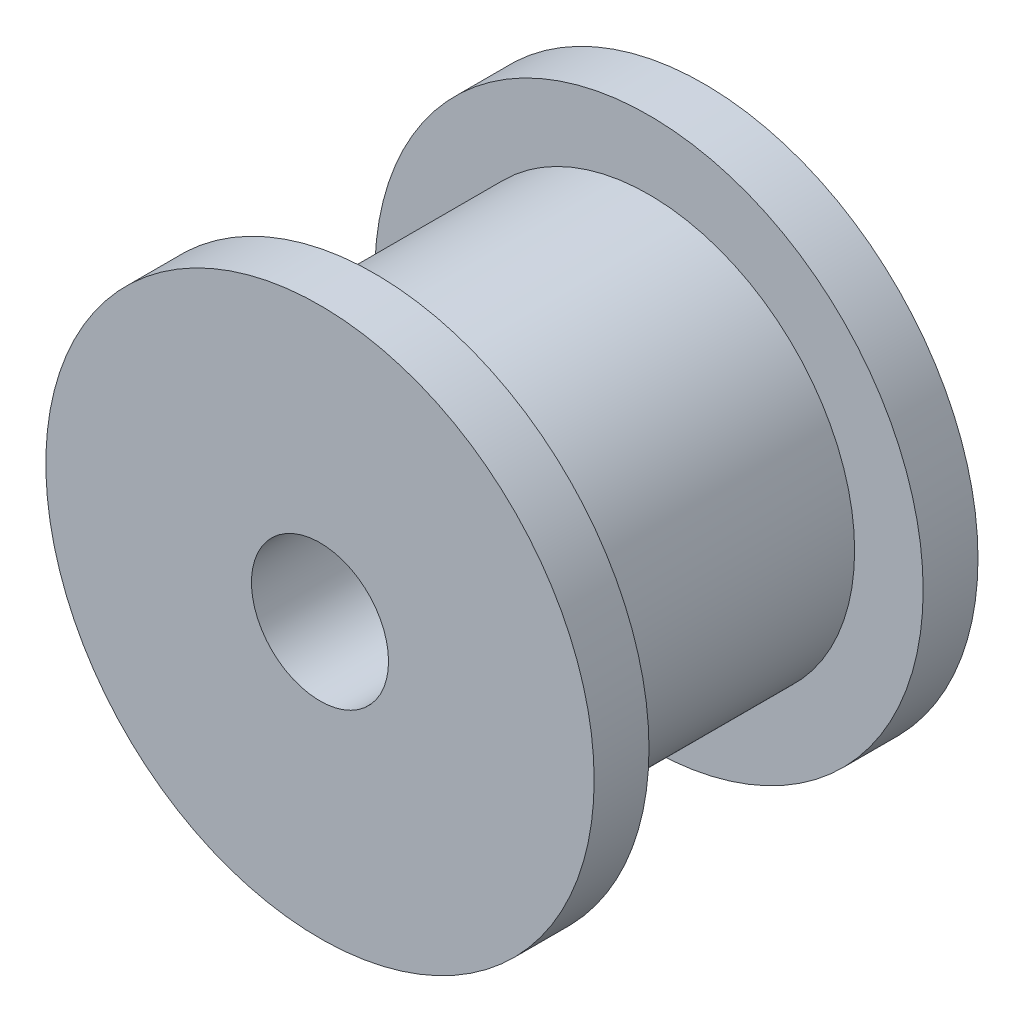
ISO-10303-21;
HEADER;
FILE_DESCRIPTION(('STEP AP214'),'2;1');
FILE_NAME('part.step','',(''),(''),'','','');
FILE_SCHEMA(('AUTOMOTIVE_DESIGN { 1 0 10303 214 1 1 1 1 }'));
ENDSEC;
DATA;
#1=APPLICATION_CONTEXT('core data for automotive mechanical design processes');
#2=APPLICATION_PROTOCOL_DEFINITION('international standard','automotive_design',2000,#1);
#3=PRODUCT_CONTEXT('',#1,'mechanical');
#4=PRODUCT('Part','Part','',(#3));
#5=PRODUCT_RELATED_PRODUCT_CATEGORY('part','',(#4));
#6=PRODUCT_DEFINITION_FORMATION('','',#4);
#7=PRODUCT_DEFINITION_CONTEXT('part definition',#1,'design');
#8=PRODUCT_DEFINITION('design','',#6,#7);
#9=PRODUCT_DEFINITION_SHAPE('','',#8);
#10=(LENGTH_UNIT() NAMED_UNIT(*) SI_UNIT(.MILLI.,.METRE.));
#11=(NAMED_UNIT(*) PLANE_ANGLE_UNIT() SI_UNIT($,.RADIAN.));
#12=(NAMED_UNIT(*) SI_UNIT($,.STERADIAN.) SOLID_ANGLE_UNIT());
#13=UNCERTAINTY_MEASURE_WITH_UNIT(LENGTH_MEASURE(1.E-05),#10,'distance_accuracy_value','');
#14=(GEOMETRIC_REPRESENTATION_CONTEXT(3) GLOBAL_UNCERTAINTY_ASSIGNED_CONTEXT((#13)) GLOBAL_UNIT_ASSIGNED_CONTEXT((#10,
#11,#12)) REPRESENTATION_CONTEXT('',''));
#15=CARTESIAN_POINT('',(0.,0.,0.));
#16=DIRECTION('',(0.,0.,1.));
#17=DIRECTION('',(1.,0.,0.));
#18=AXIS2_PLACEMENT_3D('',#15,#16,#17);
#19=CARTESIAN_POINT('',(0.,0.,7.));
#20=DIRECTION('',(0.,0.,-1.));
#21=DIRECTION('',(-1.,0.,0.));
#22=AXIS2_PLACEMENT_3D('',#19,#20,#21);
#23=CYLINDRICAL_SURFACE('',#22,10.);
#24=CARTESIAN_POINT('',(0.,0.,-7.));
#25=DIRECTION('',(0.,0.,1.));
#26=DIRECTION('',(1.,0.,0.));
#27=AXIS2_PLACEMENT_3D('',#24,#25,#26);
#28=CIRCLE('',#27,10.);
#29=CARTESIAN_POINT('',(10.,0.,-7.));
#30=VERTEX_POINT('',#29);
#31=EDGE_CURVE('E37',#30,#30,#28,.T.);
#32=ORIENTED_EDGE('',*,*,#31,.T.);
#33=EDGE_LOOP('',(#32));
#34=FACE_BOUND('',#33,.T.);
#35=CARTESIAN_POINT('',(0.,0.,-5.));
#36=DIRECTION('',(0.,0.,1.));
#37=DIRECTION('',(1.,0.,0.));
#38=AXIS2_PLACEMENT_3D('',#35,#36,#37);
#39=CIRCLE('',#38,10.);
#40=CARTESIAN_POINT('',(10.,0.,-5.));
#41=VERTEX_POINT('',#40);
#42=EDGE_CURVE('E44',#41,#41,#39,.T.);
#43=ORIENTED_EDGE('',*,*,#42,.F.);
#44=EDGE_LOOP('',(#43));
#45=FACE_BOUND('',#44,.T.);
#46=ADVANCED_FACE('F33',(#34,#45),#23,.T.);
#47=CARTESIAN_POINT('',(0.,0.,-7.));
#48=DIRECTION('',(0.,0.,1.));
#49=DIRECTION('',(1.,0.,0.));
#50=AXIS2_PLACEMENT_3D('',#47,#48,#49);
#51=PLANE('',#50);
#52=CARTESIAN_POINT('',(0.,0.,-7.));
#53=DIRECTION('',(0.,0.,1.));
#54=DIRECTION('',(1.,0.,0.));
#55=AXIS2_PLACEMENT_3D('',#52,#53,#54);
#56=CIRCLE('',#55,2.5);
#57=CARTESIAN_POINT('',(2.5,0.,-7.));
#58=VERTEX_POINT('',#57);
#59=EDGE_CURVE('E55',#58,#58,#56,.F.);
#60=ORIENTED_EDGE('',*,*,#59,.F.);
#61=EDGE_LOOP('',(#60));
#62=FACE_BOUND('',#61,.T.);
#63=ORIENTED_EDGE('',*,*,#31,.F.);
#64=EDGE_LOOP('',(#63));
#65=FACE_BOUND('',#64,.T.);
#66=ADVANCED_FACE('F81',(#62,#65),#51,.F.);
#67=CARTESIAN_POINT('',(0.,0.,-5.));
#68=DIRECTION('',(0.,0.,1.));
#69=DIRECTION('',(1.,0.,0.));
#70=AXIS2_PLACEMENT_3D('',#67,#68,#69);
#71=PLANE('',#70);
#72=CARTESIAN_POINT('',(0.,0.,-5.));
#73=DIRECTION('',(0.,0.,1.));
#74=DIRECTION('',(1.,0.,0.));
#75=AXIS2_PLACEMENT_3D('',#72,#73,#74);
#76=CIRCLE('',#75,7.5);
#77=CARTESIAN_POINT('',(7.5,0.,-5.));
#78=VERTEX_POINT('',#77);
#79=EDGE_CURVE('E49',#78,#78,#76,.T.);
#80=ORIENTED_EDGE('',*,*,#79,.F.);
#81=EDGE_LOOP('',(#80));
#82=FACE_BOUND('',#81,.T.);
#83=ORIENTED_EDGE('',*,*,#42,.T.);
#84=EDGE_LOOP('',(#83));
#85=FACE_BOUND('',#84,.T.);
#86=ADVANCED_FACE('F86',(#82,#85),#71,.T.);
#87=CARTESIAN_POINT('',(0.,0.,5.));
#88=DIRECTION('',(0.,0.,1.));
#89=DIRECTION('',(1.,0.,0.));
#90=AXIS2_PLACEMENT_3D('',#87,#88,#89);
#91=PLANE('',#90);
#92=CARTESIAN_POINT('',(0.,0.,5.));
#93=DIRECTION('',(0.,0.,1.));
#94=DIRECTION('',(1.,0.,0.));
#95=AXIS2_PLACEMENT_3D('',#92,#93,#94);
#96=CIRCLE('',#95,7.5);
#97=CARTESIAN_POINT('',(7.5,0.,5.));
#98=VERTEX_POINT('',#97);
#99=EDGE_CURVE('E52',#98,#98,#96,.T.);
#100=ORIENTED_EDGE('',*,*,#99,.T.);
#101=EDGE_LOOP('',(#100));
#102=FACE_BOUND('',#101,.T.);
#103=CARTESIAN_POINT('',(0.,0.,5.));
#104=DIRECTION('',(0.,0.,1.));
#105=DIRECTION('',(1.,0.,0.));
#106=AXIS2_PLACEMENT_3D('',#103,#104,#105);
#107=CIRCLE('',#106,10.);
#108=CARTESIAN_POINT('',(10.,0.,5.));
#109=VERTEX_POINT('',#108);
#110=EDGE_CURVE('E46',#109,#109,#107,.T.);
#111=ORIENTED_EDGE('',*,*,#110,.F.);
#112=EDGE_LOOP('',(#111));
#113=FACE_BOUND('',#112,.T.);
#114=ADVANCED_FACE('F76',(#102,#113),#91,.F.);
#115=CARTESIAN_POINT('',(0.,0.,-5.));
#116=DIRECTION('',(0.,0.,1.));
#117=DIRECTION('',(1.,0.,0.));
#118=AXIS2_PLACEMENT_3D('',#115,#116,#117);
#119=CYLINDRICAL_SURFACE('',#118,7.5);
#120=ORIENTED_EDGE('',*,*,#79,.T.);
#121=EDGE_LOOP('',(#120));
#122=FACE_BOUND('',#121,.T.);
#123=ORIENTED_EDGE('',*,*,#99,.F.);
#124=EDGE_LOOP('',(#123));
#125=FACE_BOUND('',#124,.T.);
#126=ADVANCED_FACE('F69',(#122,#125),#119,.T.);
#127=CARTESIAN_POINT('',(0.,0.,7.));
#128=DIRECTION('',(0.,0.,1.));
#129=DIRECTION('',(1.,0.,0.));
#130=AXIS2_PLACEMENT_3D('',#127,#128,#129);
#131=PLANE('',#130);
#132=CARTESIAN_POINT('',(0.,0.,7.));
#133=DIRECTION('',(0.,0.,1.));
#134=DIRECTION('',(1.,0.,0.));
#135=AXIS2_PLACEMENT_3D('',#132,#133,#134);
#136=CIRCLE('',#135,2.5);
#137=CARTESIAN_POINT('',(2.5,0.,7.));
#138=VERTEX_POINT('',#137);
#139=EDGE_CURVE('E60',#138,#138,#136,.T.);
#140=ORIENTED_EDGE('',*,*,#139,.F.);
#141=EDGE_LOOP('',(#140));
#142=FACE_BOUND('',#141,.T.);
#143=CARTESIAN_POINT('',(0.,0.,7.));
#144=DIRECTION('',(0.,0.,1.));
#145=DIRECTION('',(1.,0.,0.));
#146=AXIS2_PLACEMENT_3D('',#143,#144,#145);
#147=CIRCLE('',#146,10.);
#148=CARTESIAN_POINT('',(10.,0.,7.));
#149=VERTEX_POINT('',#148);
#150=EDGE_CURVE('E10',#149,#149,#147,.T.);
#151=ORIENTED_EDGE('',*,*,#150,.T.);
#152=EDGE_LOOP('',(#151));
#153=FACE_BOUND('',#152,.T.);
#154=ADVANCED_FACE('F67',(#142,#153),#131,.T.);
#155=ORIENTED_EDGE('',*,*,#110,.T.);
#156=EDGE_LOOP('',(#155));
#157=FACE_BOUND('',#156,.T.);
#158=ORIENTED_EDGE('',*,*,#150,.F.);
#159=EDGE_LOOP('',(#158));
#160=FACE_BOUND('',#159,.T.);
#161=ADVANCED_FACE('F35',(#157,#160),#23,.T.);
#162=CARTESIAN_POINT('',(0.,0.,-7.001));
#163=DIRECTION('',(0.,0.,1.));
#164=DIRECTION('',(1.,0.,0.));
#165=AXIS2_PLACEMENT_3D('',#162,#163,#164);
#166=CYLINDRICAL_SURFACE('',#165,2.5);
#167=CARTESIAN_POINT('',(2.5,0.,7.));
#168=CARTESIAN_POINT('',(2.5,0.,6.85416666666667));
#169=CARTESIAN_POINT('',(2.5,0.,6.70833333333333));
#170=CARTESIAN_POINT('',(2.5,0.,6.41666666666666));
#171=CARTESIAN_POINT('',(2.5,0.,6.27083333333333));
#172=CARTESIAN_POINT('',(2.5,0.,5.97916666666667));
#173=CARTESIAN_POINT('',(2.5,0.,5.83333333333333));
#174=CARTESIAN_POINT('',(2.5,0.,5.54166666666667));
#175=CARTESIAN_POINT('',(2.5,0.,5.39583333333333));
#176=CARTESIAN_POINT('',(2.5,0.,5.10416666666667));
#177=CARTESIAN_POINT('',(2.5,0.,4.95833333333333));
#178=CARTESIAN_POINT('',(2.5,0.,4.66666666666666));
#179=CARTESIAN_POINT('',(2.5,0.,4.52083333333333));
#180=CARTESIAN_POINT('',(2.5,0.,4.22916666666667));
#181=CARTESIAN_POINT('',(2.5,0.,4.08333333333333));
#182=CARTESIAN_POINT('',(2.5,0.,3.79166666666667));
#183=CARTESIAN_POINT('',(2.5,0.,3.64583333333333));
#184=CARTESIAN_POINT('',(2.5,0.,3.35416666666667));
#185=CARTESIAN_POINT('',(2.5,0.,3.20833333333333));
#186=CARTESIAN_POINT('',(2.5,0.,2.91666666666667));
#187=CARTESIAN_POINT('',(2.5,0.,2.77083333333333));
#188=CARTESIAN_POINT('',(2.5,0.,2.47916666666666));
#189=CARTESIAN_POINT('',(2.5,0.,2.33333333333333));
#190=CARTESIAN_POINT('',(2.5,0.,2.04166666666666));
#191=CARTESIAN_POINT('',(2.5,0.,1.89583333333333));
#192=CARTESIAN_POINT('',(2.5,0.,1.60416666666666));
#193=CARTESIAN_POINT('',(2.5,0.,1.45833333333333));
#194=CARTESIAN_POINT('',(2.5,0.,1.16666666666666));
#195=CARTESIAN_POINT('',(2.5,0.,1.02083333333333));
#196=CARTESIAN_POINT('',(2.5,0.,0.729166666666665));
#197=CARTESIAN_POINT('',(2.5,0.,0.583333333333332));
#198=CARTESIAN_POINT('',(2.5,0.,0.291666666666666));
#199=CARTESIAN_POINT('',(2.5,0.,0.145833333333333));
#200=CARTESIAN_POINT('',(2.5,0.,-0.145833333333334));
#201=CARTESIAN_POINT('',(2.5,0.,-0.291666666666668));
#202=CARTESIAN_POINT('',(2.5,0.,-0.583333333333334));
#203=CARTESIAN_POINT('',(2.5,0.,-0.729166666666668));
#204=CARTESIAN_POINT('',(2.5,0.,-1.02083333333333));
#205=CARTESIAN_POINT('',(2.5,0.,-1.16666666666667));
#206=CARTESIAN_POINT('',(2.5,0.,-1.45833333333333));
#207=CARTESIAN_POINT('',(2.5,0.,-1.60416666666667));
#208=CARTESIAN_POINT('',(2.5,0.,-1.89583333333333));
#209=CARTESIAN_POINT('',(2.5,0.,-2.04166666666667));
#210=CARTESIAN_POINT('',(2.5,0.,-2.33333333333333));
#211=CARTESIAN_POINT('',(2.5,0.,-2.47916666666667));
#212=CARTESIAN_POINT('',(2.5,0.,-2.77083333333333));
#213=CARTESIAN_POINT('',(2.5,0.,-2.91666666666667));
#214=CARTESIAN_POINT('',(2.5,0.,-3.20833333333333));
#215=CARTESIAN_POINT('',(2.5,0.,-3.35416666666667));
#216=CARTESIAN_POINT('',(2.5,0.,-3.64583333333333));
#217=CARTESIAN_POINT('',(2.5,0.,-3.79166666666667));
#218=CARTESIAN_POINT('',(2.5,0.,-4.08333333333333));
#219=CARTESIAN_POINT('',(2.5,0.,-4.22916666666667));
#220=CARTESIAN_POINT('',(2.5,0.,-4.52083333333333));
#221=CARTESIAN_POINT('',(2.5,0.,-4.66666666666667));
#222=CARTESIAN_POINT('',(2.5,0.,-4.95833333333333));
#223=CARTESIAN_POINT('',(2.5,0.,-5.10416666666667));
#224=CARTESIAN_POINT('',(2.5,0.,-5.39583333333333));
#225=CARTESIAN_POINT('',(2.5,0.,-5.54166666666667));
#226=CARTESIAN_POINT('',(2.5,0.,-5.83333333333333));
#227=CARTESIAN_POINT('',(2.5,0.,-5.97916666666667));
#228=CARTESIAN_POINT('',(2.5,0.,-6.27083333333333));
#229=CARTESIAN_POINT('',(2.5,0.,-6.41666666666667));
#230=CARTESIAN_POINT('',(2.5,0.,-6.70833333333333));
#231=CARTESIAN_POINT('',(2.5,0.,-6.85416666666667));
#232=CARTESIAN_POINT('',(2.5,0.,-7.));
#233=B_SPLINE_CURVE_WITH_KNOTS('',3,(#167,#168,#169,#170,#171,#172,#173,#174,#175,#176,#177,
#178,#179,#180,#181,#182,#183,#184,#185,#186,#187,#188,#189,#190,#191,#192,#193,#194,#195,#196,
#197,#198,#199,#200,#201,#202,#203,#204,#205,#206,#207,#208,#209,#210,#211,#212,#213,#214,#215,
#216,#217,#218,#219,#220,#221,#222,#223,#224,#225,#226,#227,#228,#229,#230,#231,#232),
.UNSPECIFIED.,.F.,.F.,(4,2,2,2,2,2,2,2,2,2,2,2,2,2,2,2,2,2,2,2,2,2,2,2,2,2,2,2,2,2,2,2,4),(0.,
0.4375,0.875000000000001,1.3125,1.75,2.1875,2.625,3.0625,3.5,3.9375,4.375,4.8125,5.25,5.6875,
6.125,6.5625,7.,7.4375,7.875,8.3125,8.75,9.1875,9.625,10.0625,10.5,10.9375,11.375,11.8125,12.25,
12.6875,13.125,13.5625,14.),.UNSPECIFIED.);
#234=EDGE_CURVE('BSEAM64',#138,#58,#233,.T.);
#235=ORIENTED_EDGE('',*,*,#139,.T.);
#236=ORIENTED_EDGE('',*,*,#59,.T.);
#237=ORIENTED_EDGE('',*,*,#234,.T.);
#238=ORIENTED_EDGE('',*,*,#234,.F.);
#239=EDGE_LOOP('',(#235,#237,#236,#238));
#240=FACE_BOUND('',#239,.T.);
#241=ADVANCED_FACE('F64',(#240),#166,.F.);
#242=CLOSED_SHELL('',(#46,#66,#86,#114,#126,#154,#161,#241));
#243=MANIFOLD_SOLID_BREP('B2',#242);
#244=ADVANCED_BREP_SHAPE_REPRESENTATION('',(#18,#243),#14);
#245=SHAPE_DEFINITION_REPRESENTATION(#9,#244);
ENDSEC;
END-ISO-10303-21;
